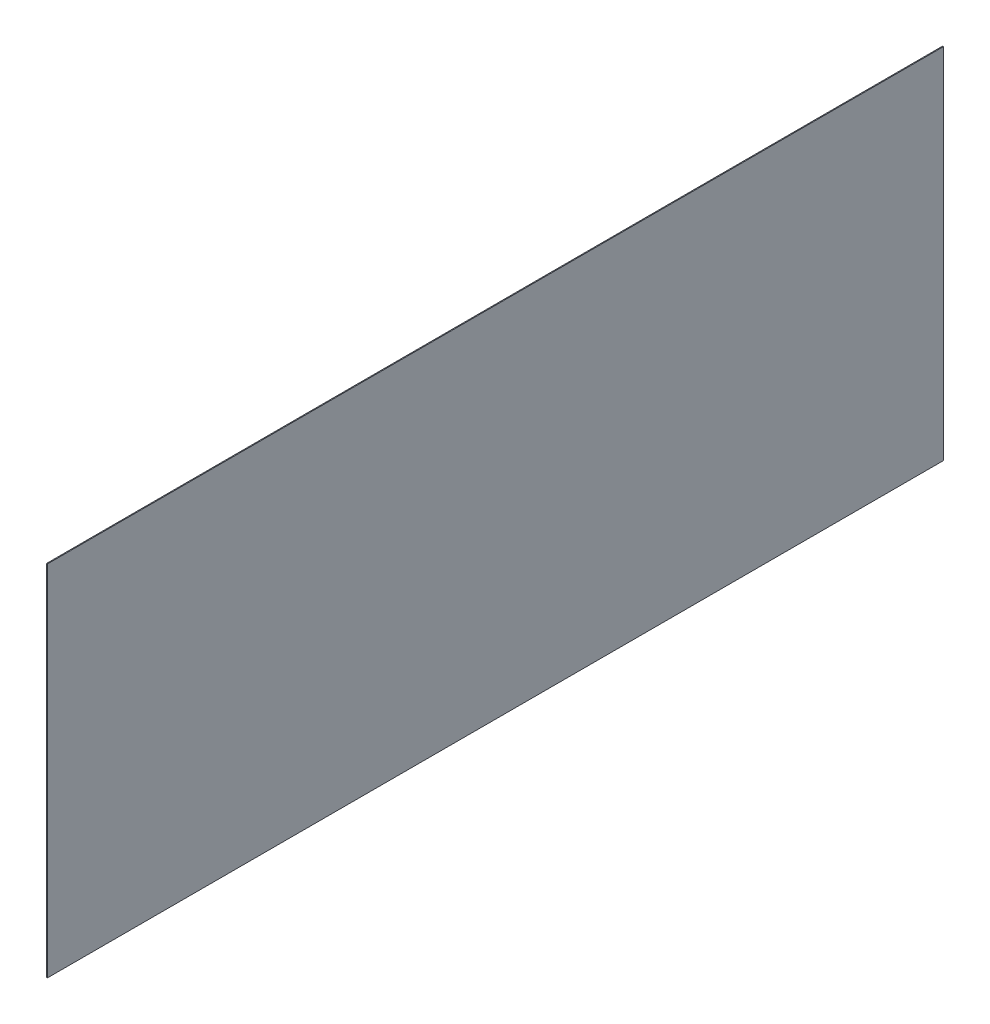
ISO-10303-21;
HEADER;
FILE_DESCRIPTION(('STEP AP214'),'2;1');
FILE_NAME('part.step','',(''),(''),'','','');
FILE_SCHEMA(('AUTOMOTIVE_DESIGN { 1 0 10303 214 1 1 1 1 }'));
ENDSEC;
DATA;
#1=APPLICATION_CONTEXT('core data for automotive mechanical design processes');
#2=APPLICATION_PROTOCOL_DEFINITION('international standard','automotive_design',2000,#1);
#3=PRODUCT_CONTEXT('',#1,'mechanical');
#4=PRODUCT('Part','Part','',(#3));
#5=PRODUCT_RELATED_PRODUCT_CATEGORY('part','',(#4));
#6=PRODUCT_DEFINITION_FORMATION('','',#4);
#7=PRODUCT_DEFINITION_CONTEXT('part definition',#1,'design');
#8=PRODUCT_DEFINITION('design','',#6,#7);
#9=PRODUCT_DEFINITION_SHAPE('','',#8);
#10=(LENGTH_UNIT() NAMED_UNIT(*) SI_UNIT(.MILLI.,.METRE.));
#11=(NAMED_UNIT(*) PLANE_ANGLE_UNIT() SI_UNIT($,.RADIAN.));
#12=(NAMED_UNIT(*) SI_UNIT($,.STERADIAN.) SOLID_ANGLE_UNIT());
#13=UNCERTAINTY_MEASURE_WITH_UNIT(LENGTH_MEASURE(1.E-05),#10,'distance_accuracy_value','');
#14=(GEOMETRIC_REPRESENTATION_CONTEXT(3) GLOBAL_UNCERTAINTY_ASSIGNED_CONTEXT((#13)) GLOBAL_UNIT_ASSIGNED_CONTEXT((#10,
#11,#12)) REPRESENTATION_CONTEXT('',''));
#15=CARTESIAN_POINT('',(0.,0.,0.));
#16=DIRECTION('',(0.,0.,1.));
#17=DIRECTION('',(1.,0.,0.));
#18=AXIS2_PLACEMENT_3D('',#15,#16,#17);
#19=CARTESIAN_POINT('',(0.1,0.,0.));
#20=DIRECTION('',(0.,0.,-1.));
#21=DIRECTION('',(-1.,0.,0.));
#22=AXIS2_PLACEMENT_3D('',#19,#20,#21);
#23=PLANE('',#22);
#24=DIRECTION('',(0.,-1.,0.));
#25=VECTOR('',#24,1.);
#26=CARTESIAN_POINT('',(0.,0.,0.));
#27=LINE('',#26,#25);
#28=CARTESIAN_POINT('',(0.,40.,0.));
#29=VERTEX_POINT('',#28);
#30=CARTESIAN_POINT('',(0.,0.,0.));
#31=VERTEX_POINT('',#30);
#32=EDGE_CURVE('E96',#29,#31,#27,.T.);
#33=ORIENTED_EDGE('',*,*,#32,.T.);
#34=DIRECTION('',(-1.,0.,0.));
#35=VECTOR('',#34,1.);
#36=CARTESIAN_POINT('',(0.1,0.,0.));
#37=LINE('',#36,#35);
#38=CARTESIAN_POINT('',(0.1,0.,0.));
#39=VERTEX_POINT('',#38);
#40=EDGE_CURVE('E11',#39,#31,#37,.T.);
#41=ORIENTED_EDGE('',*,*,#40,.F.);
#42=DIRECTION('',(0.,-1.,0.));
#43=VECTOR('',#42,1.);
#44=CARTESIAN_POINT('',(0.1,0.,0.));
#45=LINE('',#44,#43);
#46=CARTESIAN_POINT('',(0.1,40.,0.));
#47=VERTEX_POINT('',#46);
#48=EDGE_CURVE('E84',#47,#39,#45,.T.);
#49=ORIENTED_EDGE('',*,*,#48,.F.);
#50=DIRECTION('',(-1.,0.,0.));
#51=VECTOR('',#50,1.);
#52=CARTESIAN_POINT('',(0.1,40.,0.));
#53=LINE('',#52,#51);
#54=EDGE_CURVE('E92',#47,#29,#53,.T.);
#55=ORIENTED_EDGE('',*,*,#54,.T.);
#56=EDGE_LOOP('',(#33,#41,#49,#55));
#57=FACE_BOUND('',#56,.T.);
#58=ADVANCED_FACE('F33',(#57),#23,.F.);
#59=CARTESIAN_POINT('',(0.1,0.,0.));
#60=DIRECTION('',(0.,1.,0.));
#61=DIRECTION('',(0.,0.,1.));
#62=AXIS2_PLACEMENT_3D('',#59,#60,#61);
#63=PLANE('',#62);
#64=DIRECTION('',(0.,0.,-1.));
#65=VECTOR('',#64,1.);
#66=CARTESIAN_POINT('',(0.,0.,0.));
#67=LINE('',#66,#65);
#68=CARTESIAN_POINT('',(0.,0.,-100.));
#69=VERTEX_POINT('',#68);
#70=EDGE_CURVE('E88',#31,#69,#67,.T.);
#71=ORIENTED_EDGE('',*,*,#70,.T.);
#72=DIRECTION('',(-1.,0.,0.));
#73=VECTOR('',#72,1.);
#74=CARTESIAN_POINT('',(0.1,0.,-100.));
#75=LINE('',#74,#73);
#76=CARTESIAN_POINT('',(0.1,0.,-100.));
#77=VERTEX_POINT('',#76);
#78=EDGE_CURVE('E41',#77,#69,#75,.T.);
#79=ORIENTED_EDGE('',*,*,#78,.F.);
#80=DIRECTION('',(0.,0.,-1.));
#81=VECTOR('',#80,1.);
#82=CARTESIAN_POINT('',(0.1,0.,0.));
#83=LINE('',#82,#81);
#84=EDGE_CURVE('E79',#39,#77,#83,.T.);
#85=ORIENTED_EDGE('',*,*,#84,.F.);
#86=ORIENTED_EDGE('',*,*,#40,.T.);
#87=EDGE_LOOP('',(#71,#79,#85,#86));
#88=FACE_BOUND('',#87,.T.);
#89=ADVANCED_FACE('F87',(#88),#63,.F.);
#90=CARTESIAN_POINT('',(0.1,0.,-100.));
#91=DIRECTION('',(0.,0.,1.));
#92=DIRECTION('',(1.,0.,0.));
#93=AXIS2_PLACEMENT_3D('',#90,#91,#92);
#94=PLANE('',#93);
#95=DIRECTION('',(0.,1.,0.));
#96=VECTOR('',#95,1.);
#97=CARTESIAN_POINT('',(0.,0.,-100.));
#98=LINE('',#97,#96);
#99=CARTESIAN_POINT('',(0.,40.,-100.));
#100=VERTEX_POINT('',#99);
#101=EDGE_CURVE('E66',#69,#100,#98,.T.);
#102=ORIENTED_EDGE('',*,*,#101,.T.);
#103=DIRECTION('',(-1.,0.,0.));
#104=VECTOR('',#103,1.);
#105=CARTESIAN_POINT('',(0.1,40.,-100.));
#106=LINE('',#105,#104);
#107=CARTESIAN_POINT('',(0.1,40.,-100.));
#108=VERTEX_POINT('',#107);
#109=EDGE_CURVE('E89',#108,#100,#106,.T.);
#110=ORIENTED_EDGE('',*,*,#109,.F.);
#111=DIRECTION('',(0.,1.,0.));
#112=VECTOR('',#111,1.);
#113=CARTESIAN_POINT('',(0.1,0.,-100.));
#114=LINE('',#113,#112);
#115=EDGE_CURVE('E82',#77,#108,#114,.T.);
#116=ORIENTED_EDGE('',*,*,#115,.F.);
#117=ORIENTED_EDGE('',*,*,#78,.T.);
#118=EDGE_LOOP('',(#102,#110,#116,#117));
#119=FACE_BOUND('',#118,.T.);
#120=ADVANCED_FACE('F90',(#119),#94,.F.);
#121=CARTESIAN_POINT('',(0.1,40.,0.));
#122=DIRECTION('',(0.,-1.,0.));
#123=DIRECTION('',(0.,0.,-1.));
#124=AXIS2_PLACEMENT_3D('',#121,#122,#123);
#125=PLANE('',#124);
#126=DIRECTION('',(0.,0.,1.));
#127=VECTOR('',#126,1.);
#128=CARTESIAN_POINT('',(0.,40.,0.));
#129=LINE('',#128,#127);
#130=EDGE_CURVE('E72',#100,#29,#129,.T.);
#131=ORIENTED_EDGE('',*,*,#130,.T.);
#132=ORIENTED_EDGE('',*,*,#54,.F.);
#133=DIRECTION('',(0.,0.,1.));
#134=VECTOR('',#133,1.);
#135=CARTESIAN_POINT('',(0.1,40.,0.));
#136=LINE('',#135,#134);
#137=EDGE_CURVE('E49',#108,#47,#136,.T.);
#138=ORIENTED_EDGE('',*,*,#137,.F.);
#139=ORIENTED_EDGE('',*,*,#109,.T.);
#140=EDGE_LOOP('',(#131,#132,#138,#139));
#141=FACE_BOUND('',#140,.T.);
#142=ADVANCED_FACE('F103',(#141),#125,.F.);
#143=CARTESIAN_POINT('',(0.1,0.,0.));
#144=DIRECTION('',(-1.,0.,0.));
#145=DIRECTION('',(0.,0.,1.));
#146=AXIS2_PLACEMENT_3D('',#143,#144,#145);
#147=PLANE('',#146);
#148=ORIENTED_EDGE('',*,*,#48,.T.);
#149=ORIENTED_EDGE('',*,*,#84,.T.);
#150=ORIENTED_EDGE('',*,*,#115,.T.);
#151=ORIENTED_EDGE('',*,*,#137,.T.);
#152=EDGE_LOOP('',(#148,#149,#150,#151));
#153=FACE_BOUND('',#152,.T.);
#154=ADVANCED_FACE('F80',(#153),#147,.F.);
#155=CARTESIAN_POINT('',(0.,0.,0.));
#156=DIRECTION('',(-1.,0.,0.));
#157=DIRECTION('',(0.,0.,1.));
#158=AXIS2_PLACEMENT_3D('',#155,#156,#157);
#159=PLANE('',#158);
#160=ORIENTED_EDGE('',*,*,#32,.F.);
#161=ORIENTED_EDGE('',*,*,#130,.F.);
#162=ORIENTED_EDGE('',*,*,#101,.F.);
#163=ORIENTED_EDGE('',*,*,#70,.F.);
#164=EDGE_LOOP('',(#160,#161,#162,#163));
#165=FACE_BOUND('',#164,.T.);
#166=ADVANCED_FACE('F106',(#165),#159,.T.);
#167=CLOSED_SHELL('',(#58,#89,#120,#142,#154,#166));
#168=MANIFOLD_SOLID_BREP('B2',#167);
#169=ADVANCED_BREP_SHAPE_REPRESENTATION('',(#18,#168),#14);
#170=SHAPE_DEFINITION_REPRESENTATION(#9,#169);
ENDSEC;
END-ISO-10303-21;
